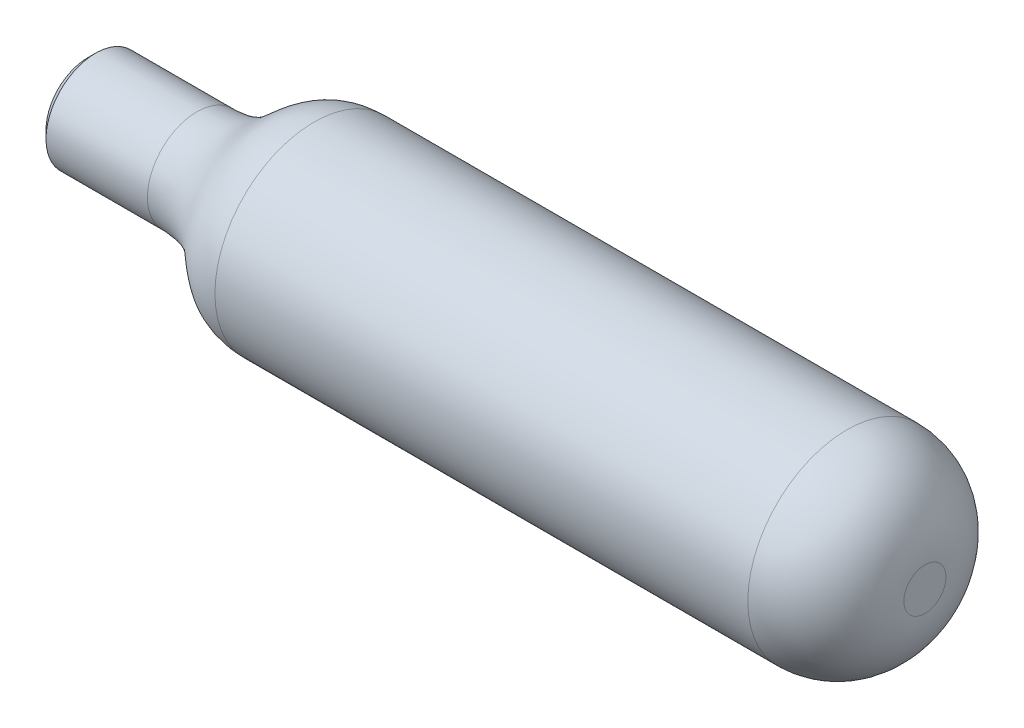
ISO-10303-21;
HEADER;
FILE_DESCRIPTION(('STEP AP214'),'2;1');
FILE_NAME('part.step','',(''),(''),'','','');
FILE_SCHEMA(('AUTOMOTIVE_DESIGN { 1 0 10303 214 1 1 1 1 }'));
ENDSEC;
DATA;
#1=APPLICATION_CONTEXT('core data for automotive mechanical design processes');
#2=APPLICATION_PROTOCOL_DEFINITION('international standard','automotive_design',2000,#1);
#3=PRODUCT_CONTEXT('',#1,'mechanical');
#4=PRODUCT('Part','Part','',(#3));
#5=PRODUCT_RELATED_PRODUCT_CATEGORY('part','',(#4));
#6=PRODUCT_DEFINITION_FORMATION('','',#4);
#7=PRODUCT_DEFINITION_CONTEXT('part definition',#1,'design');
#8=PRODUCT_DEFINITION('design','',#6,#7);
#9=PRODUCT_DEFINITION_SHAPE('','',#8);
#10=(LENGTH_UNIT() NAMED_UNIT(*) SI_UNIT(.MILLI.,.METRE.));
#11=(NAMED_UNIT(*) PLANE_ANGLE_UNIT() SI_UNIT($,.RADIAN.));
#12=(NAMED_UNIT(*) SI_UNIT($,.STERADIAN.) SOLID_ANGLE_UNIT());
#13=UNCERTAINTY_MEASURE_WITH_UNIT(LENGTH_MEASURE(1.E-05),#10,'distance_accuracy_value','');
#14=(GEOMETRIC_REPRESENTATION_CONTEXT(3) GLOBAL_UNCERTAINTY_ASSIGNED_CONTEXT((#13)) GLOBAL_UNIT_ASSIGNED_CONTEXT((#10,
#11,#12)) REPRESENTATION_CONTEXT('',''));
#15=CARTESIAN_POINT('',(0.,0.,0.));
#16=DIRECTION('',(0.,0.,1.));
#17=DIRECTION('',(1.,0.,0.));
#18=AXIS2_PLACEMENT_3D('',#15,#16,#17);
#19=CARTESIAN_POINT('',(-39.0343170620043,15.1693717385606,0.));
#20=CARTESIAN_POINT('',(-46.4250760569513,15.0317159675406,0.));
#21=CARTESIAN_POINT('',(-45.6399179348414,8.71614945488328,0.));
#22=CARTESIAN_POINT('',(-54.0343170620043,8.81937173856061,0.));
#23=B_SPLINE_CURVE_WITH_KNOTS('',3,(#19,#20,#21,#22),.UNSPECIFIED.,.F.,.F.,(4,4),(0.,1.),.UNSPECIFIED.);
#24=CARTESIAN_POINT('',(-68.0343170620043,2.46937173856061,0.));
#25=DIRECTION('',(-1.,0.,0.));
#26=AXIS1_PLACEMENT('',#24,#25);
#27=SURFACE_OF_REVOLUTION('',#23,#26);
#28=CARTESIAN_POINT('',(-54.0343170620043,2.46937173856061,0.));
#29=DIRECTION('',(-1.,0.,0.));
#30=DIRECTION('',(0.,0.,1.));
#31=AXIS2_PLACEMENT_3D('',#28,#29,#30);
#32=CIRCLE('',#31,6.35);
#33=CARTESIAN_POINT('',(-54.0343170620043,2.46937173856061,6.35));
#34=VERTEX_POINT('',#33);
#35=EDGE_CURVE('E58',#34,#34,#32,.T.);
#36=ORIENTED_EDGE('',*,*,#35,.F.);
#37=EDGE_LOOP('',(#36));
#38=FACE_BOUND('',#37,.T.);
#39=CARTESIAN_POINT('',(-39.0343170620043,2.46937173856061,0.));
#40=DIRECTION('',(-1.,0.,0.));
#41=DIRECTION('',(0.,0.,1.));
#42=AXIS2_PLACEMENT_3D('',#39,#40,#41);
#43=CIRCLE('',#42,12.7);
#44=CARTESIAN_POINT('',(-39.0343170620043,2.46937173856061,12.7));
#45=VERTEX_POINT('',#44);
#46=EDGE_CURVE('E10',#45,#45,#43,.T.);
#47=ORIENTED_EDGE('',*,*,#46,.T.);
#48=EDGE_LOOP('',(#47));
#49=FACE_BOUND('',#48,.T.);
#50=ADVANCED_FACE('F35',(#38,#49),#27,.T.);
#51=CARTESIAN_POINT('',(-68.0343170620043,2.46937173856061,0.));
#52=DIRECTION('',(-1.,0.,0.));
#53=DIRECTION('',(0.,0.,1.));
#54=AXIS2_PLACEMENT_3D('',#51,#52,#53);
#55=CYLINDRICAL_SURFACE('',#54,12.7);
#56=ORIENTED_EDGE('',*,*,#46,.F.);
#57=EDGE_LOOP('',(#56));
#58=FACE_BOUND('',#57,.T.);
#59=CARTESIAN_POINT('',(29.2656829379957,2.46937173856061,0.));
#60=DIRECTION('',(-1.,0.,0.));
#61=DIRECTION('',(0.,0.,1.));
#62=AXIS2_PLACEMENT_3D('',#59,#60,#61);
#63=CIRCLE('',#62,12.7);
#64=CARTESIAN_POINT('',(29.2656829379957,2.46937173856061,12.7));
#65=VERTEX_POINT('',#64);
#66=EDGE_CURVE('E42',#65,#65,#63,.T.);
#67=ORIENTED_EDGE('',*,*,#66,.T.);
#68=EDGE_LOOP('',(#67));
#69=FACE_BOUND('',#68,.T.);
#70=ADVANCED_FACE('F71',(#58,#69),#55,.T.);
#71=CARTESIAN_POINT('',(29.2656829379957,2.46937173856061,0.));
#72=DIRECTION('',(-1.,0.,0.));
#73=DIRECTION('',(0.,0.,1.));
#74=AXIS2_PLACEMENT_3D('',#71,#72,#73);
#75=DEGENERATE_TOROIDAL_SURFACE('',#74,2.7,10.,.T.);
#76=ORIENTED_EDGE('',*,*,#66,.F.);
#77=EDGE_LOOP('',(#76));
#78=FACE_BOUND('',#77,.T.);
#79=CARTESIAN_POINT('',(39.2656829379957,2.46937173856061,0.));
#80=DIRECTION('',(-1.,0.,0.));
#81=DIRECTION('',(0.,0.,1.));
#82=AXIS2_PLACEMENT_3D('',#79,#80,#81);
#83=CIRCLE('',#82,2.7);
#84=CARTESIAN_POINT('',(39.2656829379957,2.46937173856061,2.7));
#85=VERTEX_POINT('',#84);
#86=EDGE_CURVE('E46',#85,#85,#83,.T.);
#87=ORIENTED_EDGE('',*,*,#86,.T.);
#88=EDGE_LOOP('',(#87));
#89=FACE_BOUND('',#88,.T.);
#90=ADVANCED_FACE('F75',(#78,#89),#75,.T.);
#91=CARTESIAN_POINT('',(39.2656829379957,5.16937173856061,0.));
#92=DIRECTION('',(-1.,0.,0.));
#93=DIRECTION('',(0.,0.,1.));
#94=AXIS2_PLACEMENT_3D('',#91,#92,#93);
#95=PLANE('',#94);
#96=ORIENTED_EDGE('',*,*,#86,.F.);
#97=EDGE_LOOP('',(#96));
#98=FACE_BOUND('',#97,.T.);
#99=ADVANCED_FACE('F80',(#98),#95,.F.);
#100=CARTESIAN_POINT('',(-68.0343170620043,2.46937173856061,0.));
#101=DIRECTION('',(1.,0.,0.));
#102=DIRECTION('',(0.,0.,-1.));
#103=AXIS2_PLACEMENT_3D('',#100,#101,#102);
#104=PLANE('',#103);
#105=CARTESIAN_POINT('',(-68.0343170620043,2.46937173856061,0.));
#106=DIRECTION('',(-1.,0.,0.));
#107=DIRECTION('',(0.,0.,1.));
#108=AXIS2_PLACEMENT_3D('',#105,#106,#107);
#109=CIRCLE('',#108,5.35);
#110=CARTESIAN_POINT('',(-68.0343170620043,2.46937173856061,5.35));
#111=VERTEX_POINT('',#110);
#112=EDGE_CURVE('E50',#111,#111,#109,.T.);
#113=ORIENTED_EDGE('',*,*,#112,.T.);
#114=EDGE_LOOP('',(#113));
#115=FACE_BOUND('',#114,.T.);
#116=ADVANCED_FACE('F86',(#115),#104,.F.);
#117=CARTESIAN_POINT('',(-67.0343170620043,2.46937173856061,0.));
#118=DIRECTION('',(1.,0.,0.));
#119=DIRECTION('',(0.,0.,-1.));
#120=AXIS2_PLACEMENT_3D('',#117,#118,#119);
#121=CONICAL_SURFACE('',#120,6.35,0.785398163397447);
#122=ORIENTED_EDGE('',*,*,#112,.F.);
#123=EDGE_LOOP('',(#122));
#124=FACE_BOUND('',#123,.T.);
#125=CARTESIAN_POINT('',(-67.0343170620043,2.46937173856061,0.));
#126=DIRECTION('',(-1.,0.,0.));
#127=DIRECTION('',(0.,0.,1.));
#128=AXIS2_PLACEMENT_3D('',#125,#126,#127);
#129=CIRCLE('',#128,6.35);
#130=CARTESIAN_POINT('',(-67.0343170620043,2.46937173856061,6.35));
#131=VERTEX_POINT('',#130);
#132=EDGE_CURVE('E55',#131,#131,#129,.T.);
#133=ORIENTED_EDGE('',*,*,#132,.T.);
#134=EDGE_LOOP('',(#133));
#135=FACE_BOUND('',#134,.T.);
#136=ADVANCED_FACE('F90',(#124,#135),#121,.T.);
#137=CARTESIAN_POINT('',(-68.0343170620043,2.46937173856061,0.));
#138=DIRECTION('',(-1.,0.,0.));
#139=DIRECTION('',(0.,0.,1.));
#140=AXIS2_PLACEMENT_3D('',#137,#138,#139);
#141=CYLINDRICAL_SURFACE('',#140,6.35);
#142=ORIENTED_EDGE('',*,*,#132,.F.);
#143=EDGE_LOOP('',(#142));
#144=FACE_BOUND('',#143,.T.);
#145=ORIENTED_EDGE('',*,*,#35,.T.);
#146=EDGE_LOOP('',(#145));
#147=FACE_BOUND('',#146,.T.);
#148=ADVANCED_FACE('F68',(#144,#147),#141,.T.);
#149=CLOSED_SHELL('',(#50,#70,#90,#99,#116,#136,#148));
#150=MANIFOLD_SOLID_BREP('B2',#149);
#151=ADVANCED_BREP_SHAPE_REPRESENTATION('',(#18,#150),#14);
#152=SHAPE_DEFINITION_REPRESENTATION(#9,#151);
ENDSEC;
END-ISO-10303-21;
